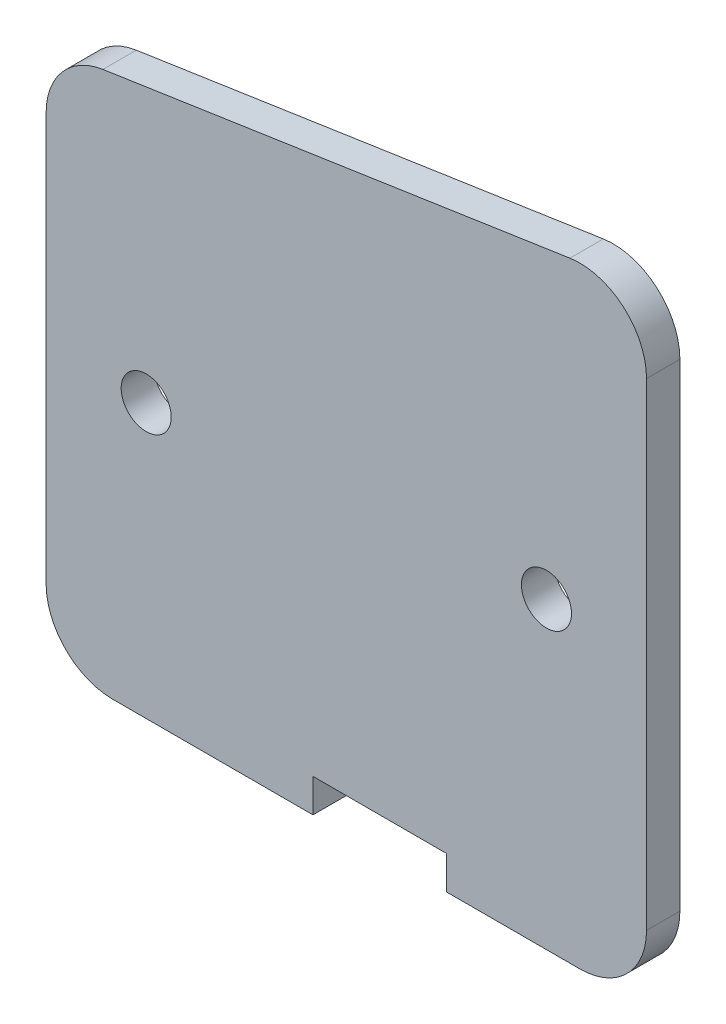
ISO-10303-21;
HEADER;
FILE_DESCRIPTION(('STEP AP214'),'2;1');
FILE_NAME('part.step','',(''),(''),'','','');
FILE_SCHEMA(('AUTOMOTIVE_DESIGN { 1 0 10303 214 1 1 1 1 }'));
ENDSEC;
DATA;
#1=APPLICATION_CONTEXT('core data for automotive mechanical design processes');
#2=APPLICATION_PROTOCOL_DEFINITION('international standard','automotive_design',2000,#1);
#3=PRODUCT_CONTEXT('',#1,'mechanical');
#4=PRODUCT('Part','Part','',(#3));
#5=PRODUCT_RELATED_PRODUCT_CATEGORY('part','',(#4));
#6=PRODUCT_DEFINITION_FORMATION('','',#4);
#7=PRODUCT_DEFINITION_CONTEXT('part definition',#1,'design');
#8=PRODUCT_DEFINITION('design','',#6,#7);
#9=PRODUCT_DEFINITION_SHAPE('','',#8);
#10=(LENGTH_UNIT() NAMED_UNIT(*) SI_UNIT(.MILLI.,.METRE.));
#11=(NAMED_UNIT(*) PLANE_ANGLE_UNIT() SI_UNIT($,.RADIAN.));
#12=(NAMED_UNIT(*) SI_UNIT($,.STERADIAN.) SOLID_ANGLE_UNIT());
#13=UNCERTAINTY_MEASURE_WITH_UNIT(LENGTH_MEASURE(1.E-05),#10,'distance_accuracy_value','');
#14=(GEOMETRIC_REPRESENTATION_CONTEXT(3) GLOBAL_UNCERTAINTY_ASSIGNED_CONTEXT((#13)) GLOBAL_UNIT_ASSIGNED_CONTEXT((#10,
#11,#12)) REPRESENTATION_CONTEXT('',''));
#15=CARTESIAN_POINT('',(0.,0.,0.));
#16=DIRECTION('',(0.,0.,1.));
#17=DIRECTION('',(1.,0.,0.));
#18=AXIS2_PLACEMENT_3D('',#15,#16,#17);
#19=CARTESIAN_POINT('',(-34.925,51.8402098778702,3.175));
#20=DIRECTION('',(0.,0.,-1.));
#21=DIRECTION('',(-1.,0.,0.));
#22=AXIS2_PLACEMENT_3D('',#19,#20,#21);
#23=CYLINDRICAL_SURFACE('',#22,6.35);
#24=CARTESIAN_POINT('',(-34.925,51.8402098778702,0.));
#25=DIRECTION('',(0.,0.,1.));
#26=DIRECTION('',(1.,0.,0.));
#27=AXIS2_PLACEMENT_3D('',#24,#25,#26);
#28=CIRCLE('',#27,6.35);
#29=CARTESIAN_POINT('',(-28.575,51.8402098778702,0.));
#30=VERTEX_POINT('',#29);
#31=CARTESIAN_POINT('',(-35.8669618761071,58.1199557185839,0.));
#32=VERTEX_POINT('',#31);
#33=EDGE_CURVE('E159',#30,#32,#28,.T.);
#34=ORIENTED_EDGE('',*,*,#33,.T.);
#35=DIRECTION('',(0.,0.,-1.));
#36=VECTOR('',#35,1.);
#37=CARTESIAN_POINT('',(-35.8669618761071,58.1199557185839,3.175));
#38=LINE('',#37,#36);
#39=CARTESIAN_POINT('',(-35.8669618761071,58.1199557185839,3.175));
#40=VERTEX_POINT('',#39);
#41=EDGE_CURVE('E11',#40,#32,#38,.T.);
#42=ORIENTED_EDGE('',*,*,#41,.F.);
#43=CARTESIAN_POINT('',(-34.925,51.8402098778702,3.175));
#44=DIRECTION('',(0.,0.,1.));
#45=DIRECTION('',(1.,0.,0.));
#46=AXIS2_PLACEMENT_3D('',#43,#44,#45);
#47=CIRCLE('',#46,6.35);
#48=CARTESIAN_POINT('',(-28.575,51.8402098778702,3.175));
#49=VERTEX_POINT('',#48);
#50=EDGE_CURVE('E99',#49,#40,#47,.T.);
#51=ORIENTED_EDGE('',*,*,#50,.F.);
#52=DIRECTION('',(0.,0.,-1.));
#53=VECTOR('',#52,1.);
#54=CARTESIAN_POINT('',(-28.575,51.8402098778702,3.175));
#55=LINE('',#54,#53);
#56=EDGE_CURVE('E158',#49,#30,#55,.T.);
#57=ORIENTED_EDGE('',*,*,#56,.T.);
#58=EDGE_LOOP('',(#34,#42,#51,#57));
#59=FACE_BOUND('',#58,.T.);
#60=ADVANCED_FACE('F35',(#59),#23,.T.);
#61=CARTESIAN_POINT('',(-9.31540342298288,62.1026894865526,3.175));
#62=DIRECTION('',(-0.148340452930245,0.988936352868297,0.));
#63=DIRECTION('',(-0.988936352868298,-0.148340452930245,0.));
#64=AXIS2_PLACEMENT_3D('',#61,#62,#63);
#65=PLANE('',#64);
#66=DIRECTION('',(0.988936352868298,0.148340452930245,0.));
#67=VECTOR('',#66,1.);
#68=CARTESIAN_POINT('',(-9.31540342298288,62.1026894865526,0.));
#69=LINE('',#68,#67);
#70=CARTESIAN_POINT('',(-80.316961876107,51.4524557185839,0.));
#71=VERTEX_POINT('',#70);
#72=EDGE_CURVE('E162',#71,#32,#69,.T.);
#73=ORIENTED_EDGE('',*,*,#72,.F.);
#74=DIRECTION('',(0.,0.,-1.));
#75=VECTOR('',#74,1.);
#76=CARTESIAN_POINT('',(-80.316961876107,51.4524557185839,3.175));
#77=LINE('',#76,#75);
#78=CARTESIAN_POINT('',(-80.316961876107,51.4524557185839,3.175));
#79=VERTEX_POINT('',#78);
#80=EDGE_CURVE('E43',#79,#71,#77,.T.);
#81=ORIENTED_EDGE('',*,*,#80,.F.);
#82=DIRECTION('',(0.988936352868298,0.148340452930245,0.));
#83=VECTOR('',#82,1.);
#84=CARTESIAN_POINT('',(-9.31540342298288,62.1026894865526,3.175));
#85=LINE('',#84,#83);
#86=EDGE_CURVE('E232',#79,#40,#85,.T.);
#87=ORIENTED_EDGE('',*,*,#86,.T.);
#88=ORIENTED_EDGE('',*,*,#41,.T.);
#89=EDGE_LOOP('',(#73,#81,#87,#88));
#90=FACE_BOUND('',#89,.T.);
#91=ADVANCED_FACE('F219',(#90),#65,.T.);
#92=CARTESIAN_POINT('',(-79.375,45.1727098778703,3.175));
#93=DIRECTION('',(0.,0.,-1.));
#94=DIRECTION('',(-1.,0.,0.));
#95=AXIS2_PLACEMENT_3D('',#92,#93,#94);
#96=CYLINDRICAL_SURFACE('',#95,6.34999999999999);
#97=CARTESIAN_POINT('',(-79.375,45.1727098778703,0.));
#98=DIRECTION('',(0.,0.,1.));
#99=DIRECTION('',(1.,0.,0.));
#100=AXIS2_PLACEMENT_3D('',#97,#98,#99);
#101=CIRCLE('',#100,6.34999999999999);
#102=CARTESIAN_POINT('',(-85.725,45.1727098778702,0.));
#103=VERTEX_POINT('',#102);
#104=EDGE_CURVE('E165',#103,#71,#101,.F.);
#105=ORIENTED_EDGE('',*,*,#104,.F.);
#106=DIRECTION('',(0.,0.,-1.));
#107=VECTOR('',#106,1.);
#108=CARTESIAN_POINT('',(-85.725,45.1727098778702,3.175));
#109=LINE('',#108,#107);
#110=CARTESIAN_POINT('',(-85.725,45.1727098778702,3.175));
#111=VERTEX_POINT('',#110);
#112=EDGE_CURVE('E209',#111,#103,#109,.T.);
#113=ORIENTED_EDGE('',*,*,#112,.F.);
#114=CARTESIAN_POINT('',(-79.375,45.1727098778703,3.175));
#115=DIRECTION('',(0.,0.,1.));
#116=DIRECTION('',(1.,0.,0.));
#117=AXIS2_PLACEMENT_3D('',#114,#115,#116);
#118=CIRCLE('',#117,6.34999999999999);
#119=EDGE_CURVE('E216',#111,#79,#118,.F.);
#120=ORIENTED_EDGE('',*,*,#119,.T.);
#121=ORIENTED_EDGE('',*,*,#80,.T.);
#122=EDGE_LOOP('',(#105,#113,#120,#121));
#123=FACE_BOUND('',#122,.T.);
#124=ADVANCED_FACE('F214',(#123),#96,.T.);
#125=CARTESIAN_POINT('',(-85.725,0.,3.175));
#126=DIRECTION('',(-1.,0.,0.));
#127=DIRECTION('',(0.,0.,1.));
#128=AXIS2_PLACEMENT_3D('',#125,#126,#127);
#129=PLANE('',#128);
#130=DIRECTION('',(0.,1.,0.));
#131=VECTOR('',#130,1.);
#132=CARTESIAN_POINT('',(-85.725,0.,0.));
#133=LINE('',#132,#131);
#134=CARTESIAN_POINT('',(-85.725,6.35000000000003,0.));
#135=VERTEX_POINT('',#134);
#136=EDGE_CURVE('E168',#135,#103,#133,.T.);
#137=ORIENTED_EDGE('',*,*,#136,.F.);
#138=DIRECTION('',(0.,0.,-1.));
#139=VECTOR('',#138,1.);
#140=CARTESIAN_POINT('',(-85.725,6.35000000000003,3.175));
#141=LINE('',#140,#139);
#142=CARTESIAN_POINT('',(-85.725,6.35000000000003,3.175));
#143=VERTEX_POINT('',#142);
#144=EDGE_CURVE('E207',#143,#135,#141,.T.);
#145=ORIENTED_EDGE('',*,*,#144,.F.);
#146=DIRECTION('',(0.,1.,0.));
#147=VECTOR('',#146,1.);
#148=CARTESIAN_POINT('',(-85.725,0.,3.175));
#149=LINE('',#148,#147);
#150=EDGE_CURVE('E231',#143,#111,#149,.T.);
#151=ORIENTED_EDGE('',*,*,#150,.T.);
#152=ORIENTED_EDGE('',*,*,#112,.T.);
#153=EDGE_LOOP('',(#137,#145,#151,#152));
#154=FACE_BOUND('',#153,.T.);
#155=ADVANCED_FACE('F227',(#154),#129,.T.);
#156=CARTESIAN_POINT('',(-79.375,6.34999999999999,3.175));
#157=DIRECTION('',(0.,0.,-1.));
#158=DIRECTION('',(-1.,0.,0.));
#159=AXIS2_PLACEMENT_3D('',#156,#157,#158);
#160=CYLINDRICAL_SURFACE('',#159,6.35);
#161=CARTESIAN_POINT('',(-79.375,6.34999999999999,0.));
#162=DIRECTION('',(0.,0.,1.));
#163=DIRECTION('',(1.,0.,0.));
#164=AXIS2_PLACEMENT_3D('',#161,#162,#163);
#165=CIRCLE('',#164,6.35);
#166=CARTESIAN_POINT('',(-79.3749999999999,0.,0.));
#167=VERTEX_POINT('',#166);
#168=EDGE_CURVE('E171',#135,#167,#165,.T.);
#169=ORIENTED_EDGE('',*,*,#168,.T.);
#170=DIRECTION('',(0.,0.,-1.));
#171=VECTOR('',#170,1.);
#172=CARTESIAN_POINT('',(-79.3749999999999,0.,3.175));
#173=LINE('',#172,#171);
#174=CARTESIAN_POINT('',(-79.3749999999999,0.,3.175));
#175=VERTEX_POINT('',#174);
#176=EDGE_CURVE('E205',#175,#167,#173,.T.);
#177=ORIENTED_EDGE('',*,*,#176,.F.);
#178=CARTESIAN_POINT('',(-79.375,6.34999999999999,3.175));
#179=DIRECTION('',(0.,0.,1.));
#180=DIRECTION('',(1.,0.,0.));
#181=AXIS2_PLACEMENT_3D('',#178,#179,#180);
#182=CIRCLE('',#181,6.35);
#183=EDGE_CURVE('E234',#143,#175,#182,.T.);
#184=ORIENTED_EDGE('',*,*,#183,.F.);
#185=ORIENTED_EDGE('',*,*,#144,.T.);
#186=EDGE_LOOP('',(#169,#177,#184,#185));
#187=FACE_BOUND('',#186,.T.);
#188=ADVANCED_FACE('F277',(#187),#160,.T.);
#189=CARTESIAN_POINT('',(0.,0.,3.175));
#190=DIRECTION('',(0.,-1.,0.));
#191=DIRECTION('',(1.,0.,0.));
#192=AXIS2_PLACEMENT_3D('',#189,#190,#191);
#193=PLANE('',#192);
#194=DIRECTION('',(-1.,0.,0.));
#195=VECTOR('',#194,1.);
#196=CARTESIAN_POINT('',(0.,0.,0.));
#197=LINE('',#196,#195);
#198=CARTESIAN_POINT('',(-60.325,0.,0.));
#199=VERTEX_POINT('',#198);
#200=EDGE_CURVE('E174',#199,#167,#197,.T.);
#201=ORIENTED_EDGE('',*,*,#200,.F.);
#202=DIRECTION('',(0.,0.,-1.));
#203=VECTOR('',#202,1.);
#204=CARTESIAN_POINT('',(-60.325,0.,3.175));
#205=LINE('',#204,#203);
#206=CARTESIAN_POINT('',(-60.325,0.,3.175));
#207=VERTEX_POINT('',#206);
#208=EDGE_CURVE('E203',#207,#199,#205,.T.);
#209=ORIENTED_EDGE('',*,*,#208,.F.);
#210=DIRECTION('',(-1.,0.,0.));
#211=VECTOR('',#210,1.);
#212=CARTESIAN_POINT('',(0.,0.,3.175));
#213=LINE('',#212,#211);
#214=EDGE_CURVE('E240',#207,#175,#213,.T.);
#215=ORIENTED_EDGE('',*,*,#214,.T.);
#216=ORIENTED_EDGE('',*,*,#176,.T.);
#217=EDGE_LOOP('',(#201,#209,#215,#216));
#218=FACE_BOUND('',#217,.T.);
#219=ADVANCED_FACE('F280',(#218),#193,.T.);
#220=CARTESIAN_POINT('',(-60.325,0.,3.175));
#221=DIRECTION('',(-1.,0.,0.));
#222=DIRECTION('',(0.,0.,1.));
#223=AXIS2_PLACEMENT_3D('',#220,#221,#222);
#224=PLANE('',#223);
#225=DIRECTION('',(0.,1.,0.));
#226=VECTOR('',#225,1.);
#227=CARTESIAN_POINT('',(-60.325,0.,0.));
#228=LINE('',#227,#226);
#229=CARTESIAN_POINT('',(-60.325,3.17499999999998,0.));
#230=VERTEX_POINT('',#229);
#231=EDGE_CURVE('E177',#199,#230,#228,.T.);
#232=ORIENTED_EDGE('',*,*,#231,.T.);
#233=DIRECTION('',(0.,0.,-1.));
#234=VECTOR('',#233,1.);
#235=CARTESIAN_POINT('',(-60.325,3.17499999999998,3.175));
#236=LINE('',#235,#234);
#237=CARTESIAN_POINT('',(-60.325,3.17499999999998,3.175));
#238=VERTEX_POINT('',#237);
#239=EDGE_CURVE('E200',#238,#230,#236,.T.);
#240=ORIENTED_EDGE('',*,*,#239,.F.);
#241=DIRECTION('',(0.,1.,0.));
#242=VECTOR('',#241,1.);
#243=CARTESIAN_POINT('',(-60.325,0.,3.175));
#244=LINE('',#243,#242);
#245=EDGE_CURVE('E243',#207,#238,#244,.T.);
#246=ORIENTED_EDGE('',*,*,#245,.F.);
#247=ORIENTED_EDGE('',*,*,#208,.T.);
#248=EDGE_LOOP('',(#232,#240,#246,#247));
#249=FACE_BOUND('',#248,.T.);
#250=ADVANCED_FACE('F284',(#249),#224,.F.);
#251=CARTESIAN_POINT('',(0.,3.17499999999998,3.175));
#252=DIRECTION('',(0.,1.,0.));
#253=DIRECTION('',(-1.,0.,0.));
#254=AXIS2_PLACEMENT_3D('',#251,#252,#253);
#255=PLANE('',#254);
#256=DIRECTION('',(1.,0.,0.));
#257=VECTOR('',#256,1.);
#258=CARTESIAN_POINT('',(0.,3.17499999999998,0.));
#259=LINE('',#258,#257);
#260=CARTESIAN_POINT('',(-47.625,3.17499999999998,0.));
#261=VERTEX_POINT('',#260);
#262=EDGE_CURVE('E179',#230,#261,#259,.T.);
#263=ORIENTED_EDGE('',*,*,#262,.T.);
#264=DIRECTION('',(0.,0.,-1.));
#265=VECTOR('',#264,1.);
#266=CARTESIAN_POINT('',(-47.625,3.17499999999998,3.175));
#267=LINE('',#266,#265);
#268=CARTESIAN_POINT('',(-47.625,3.17499999999998,3.175));
#269=VERTEX_POINT('',#268);
#270=EDGE_CURVE('E198',#269,#261,#267,.T.);
#271=ORIENTED_EDGE('',*,*,#270,.F.);
#272=DIRECTION('',(1.,0.,0.));
#273=VECTOR('',#272,1.);
#274=CARTESIAN_POINT('',(0.,3.17499999999998,3.175));
#275=LINE('',#274,#273);
#276=EDGE_CURVE('E245',#238,#269,#275,.T.);
#277=ORIENTED_EDGE('',*,*,#276,.F.);
#278=ORIENTED_EDGE('',*,*,#239,.T.);
#279=EDGE_LOOP('',(#263,#271,#277,#278));
#280=FACE_BOUND('',#279,.T.);
#281=ADVANCED_FACE('F288',(#280),#255,.F.);
#282=CARTESIAN_POINT('',(-47.625,-2.08166817117217E-13,3.175));
#283=DIRECTION('',(-1.,0.,0.));
#284=DIRECTION('',(0.,-1.,0.));
#285=AXIS2_PLACEMENT_3D('',#282,#283,#284);
#286=PLANE('',#285);
#287=DIRECTION('',(0.,1.,0.));
#288=VECTOR('',#287,1.);
#289=CARTESIAN_POINT('',(-47.625,-2.08166817117217E-13,0.));
#290=LINE('',#289,#288);
#291=CARTESIAN_POINT('',(-47.625,0.,0.));
#292=VERTEX_POINT('',#291);
#293=EDGE_CURVE('E182',#292,#261,#290,.T.);
#294=ORIENTED_EDGE('',*,*,#293,.F.);
#295=DIRECTION('',(0.,0.,-1.));
#296=VECTOR('',#295,1.);
#297=CARTESIAN_POINT('',(-47.625,0.,3.175));
#298=LINE('',#297,#296);
#299=CARTESIAN_POINT('',(-47.625,0.,3.175));
#300=VERTEX_POINT('',#299);
#301=EDGE_CURVE('E138',#300,#292,#298,.T.);
#302=ORIENTED_EDGE('',*,*,#301,.F.);
#303=DIRECTION('',(0.,1.,0.));
#304=VECTOR('',#303,1.);
#305=CARTESIAN_POINT('',(-47.625,-2.08166817117217E-13,3.175));
#306=LINE('',#305,#304);
#307=EDGE_CURVE('E145',#300,#269,#306,.T.);
#308=ORIENTED_EDGE('',*,*,#307,.T.);
#309=ORIENTED_EDGE('',*,*,#270,.T.);
#310=EDGE_LOOP('',(#294,#302,#308,#309));
#311=FACE_BOUND('',#310,.T.);
#312=ADVANCED_FACE('F248',(#311),#286,.T.);
#313=CARTESIAN_POINT('',(0.,0.,3.175));
#314=DIRECTION('',(0.,-1.,0.));
#315=DIRECTION('',(1.,0.,0.));
#316=AXIS2_PLACEMENT_3D('',#313,#314,#315);
#317=PLANE('',#316);
#318=DIRECTION('',(-1.,0.,0.));
#319=VECTOR('',#318,1.);
#320=CARTESIAN_POINT('',(0.,0.,0.));
#321=LINE('',#320,#319);
#322=CARTESIAN_POINT('',(-34.925,0.,0.));
#323=VERTEX_POINT('',#322);
#324=EDGE_CURVE('E133',#323,#292,#321,.T.);
#325=ORIENTED_EDGE('',*,*,#324,.F.);
#326=DIRECTION('',(0.,0.,-1.));
#327=VECTOR('',#326,1.);
#328=CARTESIAN_POINT('',(-34.925,0.,3.175));
#329=LINE('',#328,#327);
#330=CARTESIAN_POINT('',(-34.925,0.,3.175));
#331=VERTEX_POINT('',#330);
#332=EDGE_CURVE('E128',#331,#323,#329,.T.);
#333=ORIENTED_EDGE('',*,*,#332,.F.);
#334=DIRECTION('',(-1.,0.,0.));
#335=VECTOR('',#334,1.);
#336=CARTESIAN_POINT('',(0.,0.,3.175));
#337=LINE('',#336,#335);
#338=EDGE_CURVE('E131',#331,#300,#337,.T.);
#339=ORIENTED_EDGE('',*,*,#338,.T.);
#340=ORIENTED_EDGE('',*,*,#301,.T.);
#341=EDGE_LOOP('',(#325,#333,#339,#340));
#342=FACE_BOUND('',#341,.T.);
#343=ADVANCED_FACE('F130',(#342),#317,.T.);
#344=CARTESIAN_POINT('',(-34.925,6.34999999999999,3.175));
#345=DIRECTION('',(0.,0.,-1.));
#346=DIRECTION('',(-1.,0.,0.));
#347=AXIS2_PLACEMENT_3D('',#344,#345,#346);
#348=CYLINDRICAL_SURFACE('',#347,6.35);
#349=CARTESIAN_POINT('',(-34.925,6.34999999999999,0.));
#350=DIRECTION('',(0.,0.,1.));
#351=DIRECTION('',(1.,0.,0.));
#352=AXIS2_PLACEMENT_3D('',#349,#350,#351);
#353=CIRCLE('',#352,6.35);
#354=CARTESIAN_POINT('',(-28.575,6.35000000000004,0.));
#355=VERTEX_POINT('',#354);
#356=EDGE_CURVE('E186',#355,#323,#353,.F.);
#357=ORIENTED_EDGE('',*,*,#356,.F.);
#358=DIRECTION('',(0.,0.,-1.));
#359=VECTOR('',#358,1.);
#360=CARTESIAN_POINT('',(-28.575,6.35000000000004,3.175));
#361=LINE('',#360,#359);
#362=CARTESIAN_POINT('',(-28.575,6.35000000000004,3.175));
#363=VERTEX_POINT('',#362);
#364=EDGE_CURVE('E90',#363,#355,#361,.T.);
#365=ORIENTED_EDGE('',*,*,#364,.F.);
#366=CARTESIAN_POINT('',(-34.925,6.34999999999999,3.175));
#367=DIRECTION('',(0.,0.,1.));
#368=DIRECTION('',(1.,0.,0.));
#369=AXIS2_PLACEMENT_3D('',#366,#367,#368);
#370=CIRCLE('',#369,6.35);
#371=EDGE_CURVE('E143',#363,#331,#370,.F.);
#372=ORIENTED_EDGE('',*,*,#371,.T.);
#373=ORIENTED_EDGE('',*,*,#332,.T.);
#374=EDGE_LOOP('',(#357,#365,#372,#373));
#375=FACE_BOUND('',#374,.T.);
#376=ADVANCED_FACE('F147',(#375),#348,.T.);
#377=CARTESIAN_POINT('',(-76.2,26.0349999999999,3.175));
#378=DIRECTION('',(0.,0.,-1.));
#379=DIRECTION('',(-1.,0.,0.));
#380=AXIS2_PLACEMENT_3D('',#377,#378,#379);
#381=CYLINDRICAL_SURFACE('',#380,2.38125000000001);
#382=CARTESIAN_POINT('',(-76.2,26.0349999999999,3.175));
#383=DIRECTION('',(0.,0.,1.));
#384=DIRECTION('',(1.,0.,0.));
#385=AXIS2_PLACEMENT_3D('',#382,#383,#384);
#386=CIRCLE('',#385,2.38125000000001);
#387=CARTESIAN_POINT('',(-73.81875,26.0349999999999,3.175));
#388=VERTEX_POINT('',#387);
#389=EDGE_CURVE('E149',#388,#388,#386,.T.);
#390=ORIENTED_EDGE('',*,*,#389,.T.);
#391=EDGE_LOOP('',(#390));
#392=FACE_BOUND('',#391,.T.);
#393=CARTESIAN_POINT('',(-76.2,26.0349999999999,0.));
#394=DIRECTION('',(0.,0.,1.));
#395=DIRECTION('',(1.,0.,0.));
#396=AXIS2_PLACEMENT_3D('',#393,#394,#395);
#397=CIRCLE('',#396,2.38125000000001);
#398=CARTESIAN_POINT('',(-73.81875,26.0349999999999,0.));
#399=VERTEX_POINT('',#398);
#400=EDGE_CURVE('E189',#399,#399,#397,.T.);
#401=ORIENTED_EDGE('',*,*,#400,.F.);
#402=EDGE_LOOP('',(#401));
#403=FACE_BOUND('',#402,.T.);
#404=ADVANCED_FACE('F255',(#392,#403),#381,.F.);
#405=CARTESIAN_POINT('',(-28.575,0.,3.175));
#406=DIRECTION('',(-1.,0.,0.));
#407=DIRECTION('',(0.,0.,1.));
#408=AXIS2_PLACEMENT_3D('',#405,#406,#407);
#409=PLANE('',#408);
#410=DIRECTION('',(0.,1.,0.));
#411=VECTOR('',#410,1.);
#412=CARTESIAN_POINT('',(-28.575,0.,0.));
#413=LINE('',#412,#411);
#414=EDGE_CURVE('E93',#355,#30,#413,.T.);
#415=ORIENTED_EDGE('',*,*,#414,.T.);
#416=ORIENTED_EDGE('',*,*,#56,.F.);
#417=DIRECTION('',(0.,1.,0.));
#418=VECTOR('',#417,1.);
#419=CARTESIAN_POINT('',(-28.575,0.,3.175));
#420=LINE('',#419,#418);
#421=EDGE_CURVE('E51',#363,#49,#420,.T.);
#422=ORIENTED_EDGE('',*,*,#421,.F.);
#423=ORIENTED_EDGE('',*,*,#364,.T.);
#424=EDGE_LOOP('',(#415,#416,#422,#423));
#425=FACE_BOUND('',#424,.T.);
#426=ADVANCED_FACE('F252',(#425),#409,.F.);
#427=CARTESIAN_POINT('',(-38.1,28.8925,3.175));
#428=DIRECTION('',(0.,0.,-1.));
#429=DIRECTION('',(-1.,0.,0.));
#430=AXIS2_PLACEMENT_3D('',#427,#428,#429);
#431=CYLINDRICAL_SURFACE('',#430,2.38125);
#432=CARTESIAN_POINT('',(-38.1,28.8925,3.175));
#433=DIRECTION('',(0.,0.,1.));
#434=DIRECTION('',(1.,0.,0.));
#435=AXIS2_PLACEMENT_3D('',#432,#433,#434);
#436=CIRCLE('',#435,2.38125);
#437=CARTESIAN_POINT('',(-35.71875,28.8925,3.175));
#438=VERTEX_POINT('',#437);
#439=EDGE_CURVE('E155',#438,#438,#436,.T.);
#440=ORIENTED_EDGE('',*,*,#439,.T.);
#441=EDGE_LOOP('',(#440));
#442=FACE_BOUND('',#441,.T.);
#443=CARTESIAN_POINT('',(-38.1,28.8925,0.));
#444=DIRECTION('',(0.,0.,1.));
#445=DIRECTION('',(1.,0.,0.));
#446=AXIS2_PLACEMENT_3D('',#443,#444,#445);
#447=CIRCLE('',#446,2.38125);
#448=CARTESIAN_POINT('',(-35.71875,28.8925,0.));
#449=VERTEX_POINT('',#448);
#450=EDGE_CURVE('E192',#449,#449,#447,.T.);
#451=ORIENTED_EDGE('',*,*,#450,.F.);
#452=EDGE_LOOP('',(#451));
#453=FACE_BOUND('',#452,.T.);
#454=ADVANCED_FACE('F254',(#442,#453),#431,.F.);
#455=CARTESIAN_POINT('',(0.,0.,3.175));
#456=DIRECTION('',(0.,0.,1.));
#457=DIRECTION('',(1.,0.,0.));
#458=AXIS2_PLACEMENT_3D('',#455,#456,#457);
#459=PLANE('',#458);
#460=ORIENTED_EDGE('',*,*,#50,.T.);
#461=ORIENTED_EDGE('',*,*,#86,.F.);
#462=ORIENTED_EDGE('',*,*,#119,.F.);
#463=ORIENTED_EDGE('',*,*,#150,.F.);
#464=ORIENTED_EDGE('',*,*,#183,.T.);
#465=ORIENTED_EDGE('',*,*,#214,.F.);
#466=ORIENTED_EDGE('',*,*,#245,.T.);
#467=ORIENTED_EDGE('',*,*,#276,.T.);
#468=ORIENTED_EDGE('',*,*,#307,.F.);
#469=ORIENTED_EDGE('',*,*,#338,.F.);
#470=ORIENTED_EDGE('',*,*,#371,.F.);
#471=ORIENTED_EDGE('',*,*,#421,.T.);
#472=EDGE_LOOP('',(#460,#461,#462,#463,#464,#465,#466,#467,#468,#469,#470,#471));
#473=FACE_BOUND('',#472,.T.);
#474=ORIENTED_EDGE('',*,*,#389,.F.);
#475=EDGE_LOOP('',(#474));
#476=FACE_BOUND('',#475,.T.);
#477=ORIENTED_EDGE('',*,*,#439,.F.);
#478=EDGE_LOOP('',(#477));
#479=FACE_BOUND('',#478,.T.);
#480=ADVANCED_FACE('F141',(#473,#476,#479),#459,.T.);
#481=CARTESIAN_POINT('',(0.,0.,0.));
#482=DIRECTION('',(0.,0.,1.));
#483=DIRECTION('',(1.,0.,0.));
#484=AXIS2_PLACEMENT_3D('',#481,#482,#483);
#485=PLANE('',#484);
#486=ORIENTED_EDGE('',*,*,#33,.F.);
#487=ORIENTED_EDGE('',*,*,#414,.F.);
#488=ORIENTED_EDGE('',*,*,#356,.T.);
#489=ORIENTED_EDGE('',*,*,#324,.T.);
#490=ORIENTED_EDGE('',*,*,#293,.T.);
#491=ORIENTED_EDGE('',*,*,#262,.F.);
#492=ORIENTED_EDGE('',*,*,#231,.F.);
#493=ORIENTED_EDGE('',*,*,#200,.T.);
#494=ORIENTED_EDGE('',*,*,#168,.F.);
#495=ORIENTED_EDGE('',*,*,#136,.T.);
#496=ORIENTED_EDGE('',*,*,#104,.T.);
#497=ORIENTED_EDGE('',*,*,#72,.T.);
#498=EDGE_LOOP('',(#486,#487,#488,#489,#490,#491,#492,#493,#494,#495,#496,#497));
#499=FACE_BOUND('',#498,.T.);
#500=ORIENTED_EDGE('',*,*,#400,.T.);
#501=EDGE_LOOP('',(#500));
#502=FACE_BOUND('',#501,.T.);
#503=ORIENTED_EDGE('',*,*,#450,.T.);
#504=EDGE_LOOP('',(#503));
#505=FACE_BOUND('',#504,.T.);
#506=ADVANCED_FACE('F222',(#499,#502,#505),#485,.F.);
#507=CLOSED_SHELL('',(#60,#91,#124,#155,#188,#219,#250,#281,#312,#343,#376,#404,#426,#454,#480,#506));
#508=MANIFOLD_SOLID_BREP('B2',#507);
#509=ADVANCED_BREP_SHAPE_REPRESENTATION('',(#18,#508),#14);
#510=SHAPE_DEFINITION_REPRESENTATION(#9,#509);
ENDSEC;
END-ISO-10303-21;
